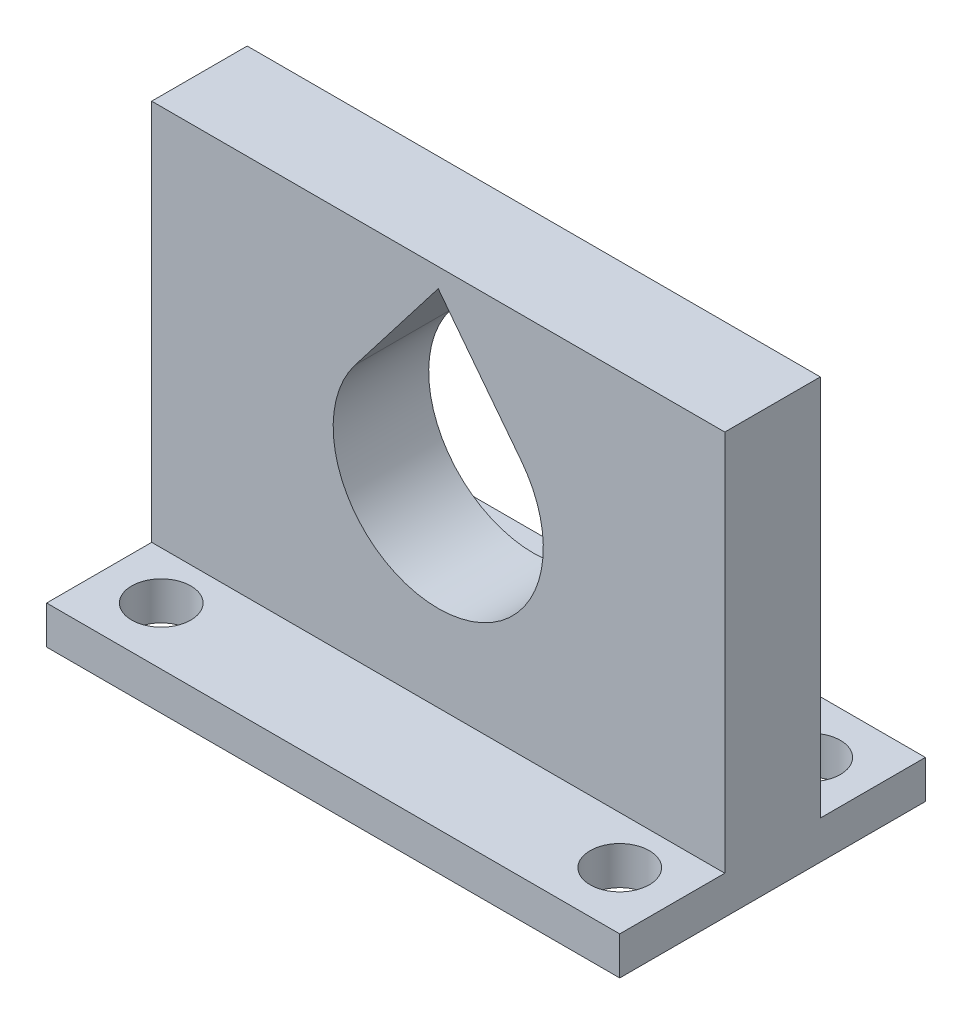
ISO-10303-21;
HEADER;
FILE_DESCRIPTION(('STEP AP214'),'2;1');
FILE_NAME('part.step','',(''),(''),'','','');
FILE_SCHEMA(('AUTOMOTIVE_DESIGN { 1 0 10303 214 1 1 1 1 }'));
ENDSEC;
DATA;
#1=APPLICATION_CONTEXT('core data for automotive mechanical design processes');
#2=APPLICATION_PROTOCOL_DEFINITION('international standard','automotive_design',2000,#1);
#3=PRODUCT_CONTEXT('',#1,'mechanical');
#4=PRODUCT('Part','Part','',(#3));
#5=PRODUCT_RELATED_PRODUCT_CATEGORY('part','',(#4));
#6=PRODUCT_DEFINITION_FORMATION('','',#4);
#7=PRODUCT_DEFINITION_CONTEXT('part definition',#1,'design');
#8=PRODUCT_DEFINITION('design','',#6,#7);
#9=PRODUCT_DEFINITION_SHAPE('','',#8);
#10=(LENGTH_UNIT() NAMED_UNIT(*) SI_UNIT(.MILLI.,.METRE.));
#11=(NAMED_UNIT(*) PLANE_ANGLE_UNIT() SI_UNIT($,.RADIAN.));
#12=(NAMED_UNIT(*) SI_UNIT($,.STERADIAN.) SOLID_ANGLE_UNIT());
#13=UNCERTAINTY_MEASURE_WITH_UNIT(LENGTH_MEASURE(1.E-05),#10,'distance_accuracy_value','');
#14=(GEOMETRIC_REPRESENTATION_CONTEXT(3) GLOBAL_UNCERTAINTY_ASSIGNED_CONTEXT((#13)) GLOBAL_UNIT_ASSIGNED_CONTEXT((#10,
#11,#12)) REPRESENTATION_CONTEXT('',''));
#15=CARTESIAN_POINT('',(0.,0.,0.));
#16=DIRECTION('',(0.,0.,1.));
#17=DIRECTION('',(1.,0.,0.));
#18=AXIS2_PLACEMENT_3D('',#15,#16,#17);
#19=CARTESIAN_POINT('',(0.,-10.,0.));
#20=DIRECTION('',(0.,-1.,0.));
#21=DIRECTION('',(0.,0.,-1.));
#22=AXIS2_PLACEMENT_3D('',#19,#20,#21);
#23=PLANE('',#22);
#24=CARTESIAN_POINT('',(-12.,-10.,-2.5));
#25=DIRECTION('',(0.,1.,0.));
#26=DIRECTION('',(0.,0.,1.));
#27=AXIS2_PLACEMENT_3D('',#24,#25,#26);
#28=CIRCLE('',#27,1.55);
#29=CARTESIAN_POINT('',(-12.,-10.,-0.950000000000002));
#30=VERTEX_POINT('',#29);
#31=EDGE_CURVE('E170',#30,#30,#28,.T.);
#32=ORIENTED_EDGE('',*,*,#31,.F.);
#33=EDGE_LOOP('',(#32));
#34=FACE_BOUND('',#33,.T.);
#35=DIRECTION('',(0.,0.,1.));
#36=VECTOR('',#35,1.);
#37=CARTESIAN_POINT('',(-15.,-10.,0.));
#38=LINE('',#37,#36);
#39=CARTESIAN_POINT('',(-15.,-10.,-5.5));
#40=VERTEX_POINT('',#39);
#41=CARTESIAN_POINT('',(-15.,-10.,0.));
#42=VERTEX_POINT('',#41);
#43=EDGE_CURVE('E223',#40,#42,#38,.T.);
#44=ORIENTED_EDGE('',*,*,#43,.T.);
#45=DIRECTION('',(1.,0.,0.));
#46=VECTOR('',#45,1.);
#47=CARTESIAN_POINT('',(0.,-10.,0.));
#48=LINE('',#47,#46);
#49=CARTESIAN_POINT('',(15.,-10.,0.));
#50=VERTEX_POINT('',#49);
#51=EDGE_CURVE('E247',#42,#50,#48,.T.);
#52=ORIENTED_EDGE('',*,*,#51,.T.);
#53=DIRECTION('',(0.,0.,1.));
#54=VECTOR('',#53,1.);
#55=CARTESIAN_POINT('',(15.,-10.,0.));
#56=LINE('',#55,#54);
#57=CARTESIAN_POINT('',(15.,-10.,-5.5));
#58=VERTEX_POINT('',#57);
#59=EDGE_CURVE('E214',#58,#50,#56,.T.);
#60=ORIENTED_EDGE('',*,*,#59,.F.);
#61=DIRECTION('',(1.,0.,0.));
#62=VECTOR('',#61,1.);
#63=CARTESIAN_POINT('',(0.,-10.,-5.5));
#64=LINE('',#63,#62);
#65=EDGE_CURVE('E202',#40,#58,#64,.T.);
#66=ORIENTED_EDGE('',*,*,#65,.F.);
#67=EDGE_LOOP('',(#44,#52,#60,#66));
#68=FACE_BOUND('',#67,.T.);
#69=CARTESIAN_POINT('',(12.,-10.,-2.5));
#70=DIRECTION('',(0.,1.,0.));
#71=DIRECTION('',(0.,0.,1.));
#72=AXIS2_PLACEMENT_3D('',#69,#70,#71);
#73=CIRCLE('',#72,1.55);
#74=CARTESIAN_POINT('',(12.,-10.,-0.949999999999999));
#75=VERTEX_POINT('',#74);
#76=EDGE_CURVE('E171',#75,#75,#73,.F.);
#77=ORIENTED_EDGE('',*,*,#76,.T.);
#78=EDGE_LOOP('',(#77));
#79=FACE_BOUND('',#78,.T.);
#80=ADVANCED_FACE('F47',(#34,#68,#79),#23,.F.);
#81=CARTESIAN_POINT('',(0.,-12.,0.));
#82=DIRECTION('',(0.,-1.,0.));
#83=DIRECTION('',(0.,0.,-1.));
#84=AXIS2_PLACEMENT_3D('',#81,#82,#83);
#85=PLANE('',#84);
#86=CARTESIAN_POINT('',(12.,-12.,-2.5));
#87=DIRECTION('',(0.,1.,0.));
#88=DIRECTION('',(0.,0.,1.));
#89=AXIS2_PLACEMENT_3D('',#86,#87,#88);
#90=CIRCLE('',#89,1.55);
#91=CARTESIAN_POINT('',(12.,-12.,-0.949999999999999));
#92=VERTEX_POINT('',#91);
#93=EDGE_CURVE('E166',#92,#92,#90,.F.);
#94=ORIENTED_EDGE('',*,*,#93,.F.);
#95=EDGE_LOOP('',(#94));
#96=FACE_BOUND('',#95,.T.);
#97=CARTESIAN_POINT('',(-12.,-12.,-2.5));
#98=DIRECTION('',(0.,1.,0.));
#99=DIRECTION('',(0.,0.,1.));
#100=AXIS2_PLACEMENT_3D('',#97,#98,#99);
#101=CIRCLE('',#100,1.55);
#102=CARTESIAN_POINT('',(-12.,-12.,-0.950000000000002));
#103=VERTEX_POINT('',#102);
#104=EDGE_CURVE('E190',#103,#103,#101,.T.);
#105=ORIENTED_EDGE('',*,*,#104,.T.);
#106=EDGE_LOOP('',(#105));
#107=FACE_BOUND('',#106,.T.);
#108=DIRECTION('',(0.,0.,1.));
#109=VECTOR('',#108,1.);
#110=CARTESIAN_POINT('',(15.,-12.,0.));
#111=LINE('',#110,#109);
#112=CARTESIAN_POINT('',(15.,-12.,-5.5));
#113=VERTEX_POINT('',#112);
#114=CARTESIAN_POINT('',(15.,-12.,10.5));
#115=VERTEX_POINT('',#114);
#116=EDGE_CURVE('E198',#113,#115,#111,.T.);
#117=ORIENTED_EDGE('',*,*,#116,.T.);
#118=DIRECTION('',(1.,0.,0.));
#119=VECTOR('',#118,1.);
#120=CARTESIAN_POINT('',(0.,-12.,10.5));
#121=LINE('',#120,#119);
#122=CARTESIAN_POINT('',(-15.,-12.,10.5));
#123=VERTEX_POINT('',#122);
#124=EDGE_CURVE('E201',#123,#115,#121,.T.);
#125=ORIENTED_EDGE('',*,*,#124,.F.);
#126=DIRECTION('',(0.,0.,1.));
#127=VECTOR('',#126,1.);
#128=CARTESIAN_POINT('',(-15.,-12.,0.));
#129=LINE('',#128,#127);
#130=CARTESIAN_POINT('',(-15.,-12.,-5.5));
#131=VERTEX_POINT('',#130);
#132=EDGE_CURVE('E206',#131,#123,#129,.T.);
#133=ORIENTED_EDGE('',*,*,#132,.F.);
#134=DIRECTION('',(1.,0.,0.));
#135=VECTOR('',#134,1.);
#136=CARTESIAN_POINT('',(0.,-12.,-5.5));
#137=LINE('',#136,#135);
#138=EDGE_CURVE('E210',#131,#113,#137,.T.);
#139=ORIENTED_EDGE('',*,*,#138,.T.);
#140=EDGE_LOOP('',(#117,#125,#133,#139));
#141=FACE_BOUND('',#140,.T.);
#142=CARTESIAN_POINT('',(12.,-12.,7.5));
#143=DIRECTION('',(0.,1.,0.));
#144=DIRECTION('',(0.,0.,1.));
#145=AXIS2_PLACEMENT_3D('',#142,#143,#144);
#146=CIRCLE('',#145,1.55);
#147=CARTESIAN_POINT('',(12.,-12.,9.05));
#148=VERTEX_POINT('',#147);
#149=EDGE_CURVE('E175',#148,#148,#146,.T.);
#150=ORIENTED_EDGE('',*,*,#149,.T.);
#151=EDGE_LOOP('',(#150));
#152=FACE_BOUND('',#151,.T.);
#153=CARTESIAN_POINT('',(-12.,-12.,7.5));
#154=DIRECTION('',(0.,1.,0.));
#155=DIRECTION('',(0.,0.,1.));
#156=AXIS2_PLACEMENT_3D('',#153,#154,#155);
#157=CIRCLE('',#156,1.55);
#158=CARTESIAN_POINT('',(-12.,-12.,9.05));
#159=VERTEX_POINT('',#158);
#160=EDGE_CURVE('E183',#159,#159,#157,.F.);
#161=ORIENTED_EDGE('',*,*,#160,.F.);
#162=EDGE_LOOP('',(#161));
#163=FACE_BOUND('',#162,.T.);
#164=ADVANCED_FACE('F300',(#96,#107,#141,#152,#163),#85,.T.);
#165=CARTESIAN_POINT('',(12.,-10.,7.5));
#166=DIRECTION('',(0.,1.,0.));
#167=DIRECTION('',(0.,0.,1.));
#168=AXIS2_PLACEMENT_3D('',#165,#166,#167);
#169=CIRCLE('',#168,1.55);
#170=CARTESIAN_POINT('',(12.,-10.,9.05));
#171=VERTEX_POINT('',#170);
#172=EDGE_CURVE('E179',#171,#171,#169,.T.);
#173=ORIENTED_EDGE('',*,*,#172,.F.);
#174=EDGE_LOOP('',(#173));
#175=FACE_BOUND('',#174,.T.);
#176=DIRECTION('',(1.,0.,0.));
#177=VECTOR('',#176,1.);
#178=CARTESIAN_POINT('',(0.,-10.,5.));
#179=LINE('',#178,#177);
#180=CARTESIAN_POINT('',(-15.,-10.,5.));
#181=VERTEX_POINT('',#180);
#182=CARTESIAN_POINT('',(15.,-10.,5.));
#183=VERTEX_POINT('',#182);
#184=EDGE_CURVE('E255',#181,#183,#179,.T.);
#185=ORIENTED_EDGE('',*,*,#184,.F.);
#186=CARTESIAN_POINT('',(-15.,-10.,10.5));
#187=VERTEX_POINT('',#186);
#188=EDGE_CURVE('E222',#181,#187,#38,.T.);
#189=ORIENTED_EDGE('',*,*,#188,.T.);
#190=DIRECTION('',(1.,0.,0.));
#191=VECTOR('',#190,1.);
#192=CARTESIAN_POINT('',(0.,-10.,10.5));
#193=LINE('',#192,#191);
#194=CARTESIAN_POINT('',(15.,-10.,10.5));
#195=VERTEX_POINT('',#194);
#196=EDGE_CURVE('E218',#187,#195,#193,.T.);
#197=ORIENTED_EDGE('',*,*,#196,.T.);
#198=EDGE_CURVE('E194',#183,#195,#56,.T.);
#199=ORIENTED_EDGE('',*,*,#198,.F.);
#200=EDGE_LOOP('',(#185,#189,#197,#199));
#201=FACE_BOUND('',#200,.T.);
#202=CARTESIAN_POINT('',(-12.,-10.,7.5));
#203=DIRECTION('',(0.,1.,0.));
#204=DIRECTION('',(0.,0.,1.));
#205=AXIS2_PLACEMENT_3D('',#202,#203,#204);
#206=CIRCLE('',#205,1.55);
#207=CARTESIAN_POINT('',(-12.,-10.,9.05));
#208=VERTEX_POINT('',#207);
#209=EDGE_CURVE('E165',#208,#208,#206,.F.);
#210=ORIENTED_EDGE('',*,*,#209,.T.);
#211=EDGE_LOOP('',(#210));
#212=FACE_BOUND('',#211,.T.);
#213=ADVANCED_FACE('F305',(#175,#201,#212),#23,.F.);
#214=CARTESIAN_POINT('',(15.,0.,5.));
#215=DIRECTION('',(-1.,0.,0.));
#216=DIRECTION('',(0.,0.,1.));
#217=AXIS2_PLACEMENT_3D('',#214,#215,#216);
#218=PLANE('',#217);
#219=DIRECTION('',(0.,1.,0.));
#220=VECTOR('',#219,1.);
#221=CARTESIAN_POINT('',(15.,0.,0.));
#222=LINE('',#221,#220);
#223=CARTESIAN_POINT('',(15.,10.,0.));
#224=VERTEX_POINT('',#223);
#225=EDGE_CURVE('E242',#50,#224,#222,.T.);
#226=ORIENTED_EDGE('',*,*,#225,.T.);
#227=DIRECTION('',(0.,0.,-1.));
#228=VECTOR('',#227,1.);
#229=CARTESIAN_POINT('',(15.,10.,5.));
#230=LINE('',#229,#228);
#231=CARTESIAN_POINT('',(15.,10.,5.));
#232=VERTEX_POINT('',#231);
#233=EDGE_CURVE('E11',#232,#224,#230,.T.);
#234=ORIENTED_EDGE('',*,*,#233,.F.);
#235=DIRECTION('',(0.,1.,0.));
#236=VECTOR('',#235,1.);
#237=CARTESIAN_POINT('',(15.,0.,5.));
#238=LINE('',#237,#236);
#239=EDGE_CURVE('E243',#183,#232,#238,.T.);
#240=ORIENTED_EDGE('',*,*,#239,.F.);
#241=ORIENTED_EDGE('',*,*,#198,.T.);
#242=DIRECTION('',(0.,1.,0.));
#243=VECTOR('',#242,1.);
#244=CARTESIAN_POINT('',(15.,-12.,10.5));
#245=LINE('',#244,#243);
#246=EDGE_CURVE('E238',#115,#195,#245,.T.);
#247=ORIENTED_EDGE('',*,*,#246,.F.);
#248=ORIENTED_EDGE('',*,*,#116,.F.);
#249=DIRECTION('',(0.,1.,0.));
#250=VECTOR('',#249,1.);
#251=CARTESIAN_POINT('',(15.,-12.,-5.5));
#252=LINE('',#251,#250);
#253=EDGE_CURVE('E213',#113,#58,#252,.T.);
#254=ORIENTED_EDGE('',*,*,#253,.T.);
#255=ORIENTED_EDGE('',*,*,#59,.T.);
#256=EDGE_LOOP('',(#226,#234,#240,#241,#247,#248,#254,#255));
#257=FACE_BOUND('',#256,.T.);
#258=ADVANCED_FACE('F49',(#257),#218,.F.);
#259=CARTESIAN_POINT('',(0.,10.,5.));
#260=DIRECTION('',(0.,1.,0.));
#261=DIRECTION('',(0.,0.,1.));
#262=AXIS2_PLACEMENT_3D('',#259,#260,#261);
#263=PLANE('',#262);
#264=DIRECTION('',(1.,0.,0.));
#265=VECTOR('',#264,1.);
#266=CARTESIAN_POINT('',(0.,10.,0.));
#267=LINE('',#266,#265);
#268=CARTESIAN_POINT('',(-15.,10.,0.));
#269=VERTEX_POINT('',#268);
#270=EDGE_CURVE('E262',#269,#224,#267,.T.);
#271=ORIENTED_EDGE('',*,*,#270,.F.);
#272=DIRECTION('',(0.,0.,-1.));
#273=VECTOR('',#272,1.);
#274=CARTESIAN_POINT('',(-15.,10.,5.));
#275=LINE('',#274,#273);
#276=CARTESIAN_POINT('',(-15.,10.,5.));
#277=VERTEX_POINT('',#276);
#278=EDGE_CURVE('E56',#277,#269,#275,.T.);
#279=ORIENTED_EDGE('',*,*,#278,.F.);
#280=DIRECTION('',(1.,0.,0.));
#281=VECTOR('',#280,1.);
#282=CARTESIAN_POINT('',(0.,10.,5.));
#283=LINE('',#282,#281);
#284=EDGE_CURVE('E246',#277,#232,#283,.T.);
#285=ORIENTED_EDGE('',*,*,#284,.T.);
#286=ORIENTED_EDGE('',*,*,#233,.T.);
#287=EDGE_LOOP('',(#271,#279,#285,#286));
#288=FACE_BOUND('',#287,.T.);
#289=ADVANCED_FACE('F281',(#288),#263,.T.);
#290=CARTESIAN_POINT('',(-15.,0.,5.));
#291=DIRECTION('',(-1.,0.,0.));
#292=DIRECTION('',(0.,0.,1.));
#293=AXIS2_PLACEMENT_3D('',#290,#291,#292);
#294=PLANE('',#293);
#295=DIRECTION('',(0.,1.,0.));
#296=VECTOR('',#295,1.);
#297=CARTESIAN_POINT('',(-15.,0.,0.));
#298=LINE('',#297,#296);
#299=EDGE_CURVE('E266',#42,#269,#298,.T.);
#300=ORIENTED_EDGE('',*,*,#299,.F.);
#301=ORIENTED_EDGE('',*,*,#43,.F.);
#302=DIRECTION('',(0.,1.,0.));
#303=VECTOR('',#302,1.);
#304=CARTESIAN_POINT('',(-15.,-12.,-5.5));
#305=LINE('',#304,#303);
#306=EDGE_CURVE('E231',#131,#40,#305,.T.);
#307=ORIENTED_EDGE('',*,*,#306,.F.);
#308=ORIENTED_EDGE('',*,*,#132,.T.);
#309=DIRECTION('',(0.,1.,0.));
#310=VECTOR('',#309,1.);
#311=CARTESIAN_POINT('',(-15.,-12.,10.5));
#312=LINE('',#311,#310);
#313=EDGE_CURVE('E234',#123,#187,#312,.T.);
#314=ORIENTED_EDGE('',*,*,#313,.T.);
#315=ORIENTED_EDGE('',*,*,#188,.F.);
#316=DIRECTION('',(0.,1.,0.));
#317=VECTOR('',#316,1.);
#318=CARTESIAN_POINT('',(-15.,0.,5.));
#319=LINE('',#318,#317);
#320=EDGE_CURVE('E251',#181,#277,#319,.T.);
#321=ORIENTED_EDGE('',*,*,#320,.T.);
#322=ORIENTED_EDGE('',*,*,#278,.T.);
#323=EDGE_LOOP('',(#300,#301,#307,#308,#314,#315,#321,#322));
#324=FACE_BOUND('',#323,.T.);
#325=ADVANCED_FACE('F275',(#324),#294,.T.);
#326=CARTESIAN_POINT('',(0.,0.,5.));
#327=DIRECTION('',(0.,0.,1.));
#328=DIRECTION('',(1.,0.,0.));
#329=AXIS2_PLACEMENT_3D('',#326,#327,#328);
#330=PLANE('',#329);
#331=DIRECTION('',(-0.611091633143925,0.791559862487664,0.));
#332=VECTOR('',#331,1.);
#333=CARTESIAN_POINT('',(4.35344048188891,3.36089685688659,5.));
#334=LINE('',#333,#332);
#335=CARTESIAN_POINT('',(4.32660605717415,3.39565605237397,5.));
#336=VERTEX_POINT('',#335);
#337=CARTESIAN_POINT('',(0.,9.,5.));
#338=VERTEX_POINT('',#337);
#339=EDGE_CURVE('E162',#336,#338,#334,.T.);
#340=ORIENTED_EDGE('',*,*,#339,.F.);
#341=CARTESIAN_POINT('',(0.,0.,5.));
#342=DIRECTION('',(0.,0.,1.));
#343=DIRECTION('',(1.,0.,0.));
#344=AXIS2_PLACEMENT_3D('',#341,#342,#343);
#345=CIRCLE('',#344,5.5);
#346=CARTESIAN_POINT('',(-4.3534965371257,3.36111111111111,5.));
#347=VERTEX_POINT('',#346);
#348=EDGE_CURVE('E156',#347,#336,#345,.T.);
#349=ORIENTED_EDGE('',*,*,#348,.F.);
#350=DIRECTION('',(0.611111111111111,0.791544824931945,0.));
#351=VECTOR('',#350,1.);
#352=CARTESIAN_POINT('',(-4.3534965371257,3.36111111111111,5.));
#353=LINE('',#352,#351);
#354=EDGE_CURVE('E135',#347,#338,#353,.T.);
#355=ORIENTED_EDGE('',*,*,#354,.T.);
#356=EDGE_LOOP('',(#340,#349,#355));
#357=FACE_BOUND('',#356,.T.);
#358=ORIENTED_EDGE('',*,*,#239,.T.);
#359=ORIENTED_EDGE('',*,*,#284,.F.);
#360=ORIENTED_EDGE('',*,*,#320,.F.);
#361=ORIENTED_EDGE('',*,*,#184,.T.);
#362=EDGE_LOOP('',(#358,#359,#360,#361));
#363=FACE_BOUND('',#362,.T.);
#364=ADVANCED_FACE('F311',(#357,#363),#330,.T.);
#365=CARTESIAN_POINT('',(0.,0.,0.));
#366=DIRECTION('',(0.,0.,1.));
#367=DIRECTION('',(1.,0.,0.));
#368=AXIS2_PLACEMENT_3D('',#365,#366,#367);
#369=PLANE('',#368);
#370=CARTESIAN_POINT('',(0.,0.,0.));
#371=DIRECTION('',(0.,0.,-1.));
#372=DIRECTION('',(-1.,0.,0.));
#373=AXIS2_PLACEMENT_3D('',#370,#371,#372);
#374=CIRCLE('',#373,5.5);
#375=CARTESIAN_POINT('',(4.32660605717415,3.39565605237397,0.));
#376=VERTEX_POINT('',#375);
#377=CARTESIAN_POINT('',(-4.3534965371257,3.36111111111111,0.));
#378=VERTEX_POINT('',#377);
#379=EDGE_CURVE('E142',#376,#378,#374,.T.);
#380=ORIENTED_EDGE('',*,*,#379,.F.);
#381=DIRECTION('',(0.611091633143925,-0.791559862487664,0.));
#382=VECTOR('',#381,1.);
#383=CARTESIAN_POINT('',(4.35344048188891,3.36089685688659,0.));
#384=LINE('',#383,#382);
#385=CARTESIAN_POINT('',(0.,9.,0.));
#386=VERTEX_POINT('',#385);
#387=EDGE_CURVE('E71',#386,#376,#384,.T.);
#388=ORIENTED_EDGE('',*,*,#387,.F.);
#389=DIRECTION('',(-0.611111111111111,-0.791544824931945,0.));
#390=VECTOR('',#389,1.);
#391=CARTESIAN_POINT('',(-4.3534965371257,3.36111111111111,0.));
#392=LINE('',#391,#390);
#393=EDGE_CURVE('E133',#386,#378,#392,.T.);
#394=ORIENTED_EDGE('',*,*,#393,.T.);
#395=EDGE_LOOP('',(#380,#388,#394));
#396=FACE_BOUND('',#395,.T.);
#397=ORIENTED_EDGE('',*,*,#225,.F.);
#398=ORIENTED_EDGE('',*,*,#51,.F.);
#399=ORIENTED_EDGE('',*,*,#299,.T.);
#400=ORIENTED_EDGE('',*,*,#270,.T.);
#401=EDGE_LOOP('',(#397,#398,#399,#400));
#402=FACE_BOUND('',#401,.T.);
#403=ADVANCED_FACE('F147',(#396,#402),#369,.F.);
#404=CARTESIAN_POINT('',(0.,-12.,10.5));
#405=DIRECTION('',(0.,0.,1.));
#406=DIRECTION('',(1.,0.,0.));
#407=AXIS2_PLACEMENT_3D('',#404,#405,#406);
#408=PLANE('',#407);
#409=ORIENTED_EDGE('',*,*,#196,.F.);
#410=ORIENTED_EDGE('',*,*,#313,.F.);
#411=ORIENTED_EDGE('',*,*,#124,.T.);
#412=ORIENTED_EDGE('',*,*,#246,.T.);
#413=EDGE_LOOP('',(#409,#410,#411,#412));
#414=FACE_BOUND('',#413,.T.);
#415=ADVANCED_FACE('F303',(#414),#408,.T.);
#416=CARTESIAN_POINT('',(0.,-12.,-5.5));
#417=DIRECTION('',(0.,0.,1.));
#418=DIRECTION('',(1.,0.,0.));
#419=AXIS2_PLACEMENT_3D('',#416,#417,#418);
#420=PLANE('',#419);
#421=ORIENTED_EDGE('',*,*,#65,.T.);
#422=ORIENTED_EDGE('',*,*,#253,.F.);
#423=ORIENTED_EDGE('',*,*,#138,.F.);
#424=ORIENTED_EDGE('',*,*,#306,.T.);
#425=EDGE_LOOP('',(#421,#422,#423,#424));
#426=FACE_BOUND('',#425,.T.);
#427=ADVANCED_FACE('F295',(#426),#420,.F.);
#428=CARTESIAN_POINT('',(12.,-12.,7.5));
#429=DIRECTION('',(0.,1.,0.));
#430=DIRECTION('',(0.,0.,1.));
#431=AXIS2_PLACEMENT_3D('',#428,#429,#430);
#432=CYLINDRICAL_SURFACE('',#431,1.55);
#433=ORIENTED_EDGE('',*,*,#149,.F.);
#434=EDGE_LOOP('',(#433));
#435=FACE_BOUND('',#434,.T.);
#436=ORIENTED_EDGE('',*,*,#172,.T.);
#437=EDGE_LOOP('',(#436));
#438=FACE_BOUND('',#437,.T.);
#439=ADVANCED_FACE('F343',(#435,#438),#432,.F.);
#440=CARTESIAN_POINT('',(-12.,-12.,7.5));
#441=DIRECTION('',(0.,1.,0.));
#442=DIRECTION('',(0.,0.,1.));
#443=AXIS2_PLACEMENT_3D('',#440,#441,#442);
#444=CYLINDRICAL_SURFACE('',#443,1.55);
#445=ORIENTED_EDGE('',*,*,#160,.T.);
#446=EDGE_LOOP('',(#445));
#447=FACE_BOUND('',#446,.T.);
#448=ORIENTED_EDGE('',*,*,#209,.F.);
#449=EDGE_LOOP('',(#448));
#450=FACE_BOUND('',#449,.T.);
#451=ADVANCED_FACE('F344',(#447,#450),#444,.F.);
#452=CARTESIAN_POINT('',(-12.,-12.,-2.5));
#453=DIRECTION('',(0.,1.,0.));
#454=DIRECTION('',(0.,0.,1.));
#455=AXIS2_PLACEMENT_3D('',#452,#453,#454);
#456=CYLINDRICAL_SURFACE('',#455,1.55);
#457=ORIENTED_EDGE('',*,*,#104,.F.);
#458=EDGE_LOOP('',(#457));
#459=FACE_BOUND('',#458,.T.);
#460=ORIENTED_EDGE('',*,*,#31,.T.);
#461=EDGE_LOOP('',(#460));
#462=FACE_BOUND('',#461,.T.);
#463=ADVANCED_FACE('F350',(#459,#462),#456,.F.);
#464=CARTESIAN_POINT('',(12.,-12.,-2.5));
#465=DIRECTION('',(0.,1.,0.));
#466=DIRECTION('',(0.,0.,1.));
#467=AXIS2_PLACEMENT_3D('',#464,#465,#466);
#468=CYLINDRICAL_SURFACE('',#467,1.55);
#469=ORIENTED_EDGE('',*,*,#93,.T.);
#470=EDGE_LOOP('',(#469));
#471=FACE_BOUND('',#470,.T.);
#472=ORIENTED_EDGE('',*,*,#76,.F.);
#473=EDGE_LOOP('',(#472));
#474=FACE_BOUND('',#473,.T.);
#475=ADVANCED_FACE('F355',(#471,#474),#468,.F.);
#476=CARTESIAN_POINT('',(4.35344048188891,3.36089685688659,10.));
#477=DIRECTION('',(0.791559862487664,0.611091633143925,0.));
#478=DIRECTION('',(-0.611091633143925,0.791559862487664,0.));
#479=AXIS2_PLACEMENT_3D('',#476,#477,#478);
#480=PLANE('',#479);
#481=ORIENTED_EDGE('',*,*,#339,.T.);
#482=DIRECTION('',(0.,0.,-1.));
#483=VECTOR('',#482,1.);
#484=CARTESIAN_POINT('',(0.,9.,10.));
#485=LINE('',#484,#483);
#486=EDGE_CURVE('E138',#338,#386,#485,.T.);
#487=ORIENTED_EDGE('',*,*,#486,.T.);
#488=ORIENTED_EDGE('',*,*,#387,.T.);
#489=DIRECTION('',(0.,0.,-1.));
#490=VECTOR('',#489,1.);
#491=CARTESIAN_POINT('',(4.32660605717415,3.39565605237397,10.));
#492=LINE('',#491,#490);
#493=EDGE_CURVE('E139',#336,#376,#492,.T.);
#494=ORIENTED_EDGE('',*,*,#493,.F.);
#495=EDGE_LOOP('',(#481,#487,#488,#494));
#496=FACE_BOUND('',#495,.T.);
#497=ADVANCED_FACE('F362',(#496),#480,.F.);
#498=CARTESIAN_POINT('',(-4.3534965371257,3.36111111111111,10.));
#499=DIRECTION('',(0.791544824931945,-0.611111111111111,0.));
#500=DIRECTION('',(0.611111111111111,0.791544824931945,0.));
#501=AXIS2_PLACEMENT_3D('',#498,#499,#500);
#502=PLANE('',#501);
#503=DIRECTION('',(0.,0.,-1.));
#504=VECTOR('',#503,1.);
#505=CARTESIAN_POINT('',(-4.3534965371257,3.36111111111111,10.));
#506=LINE('',#505,#504);
#507=EDGE_CURVE('E63',#347,#378,#506,.T.);
#508=ORIENTED_EDGE('',*,*,#507,.T.);
#509=ORIENTED_EDGE('',*,*,#393,.F.);
#510=ORIENTED_EDGE('',*,*,#486,.F.);
#511=ORIENTED_EDGE('',*,*,#354,.F.);
#512=EDGE_LOOP('',(#508,#509,#510,#511));
#513=FACE_BOUND('',#512,.T.);
#514=ADVANCED_FACE('F130',(#513),#502,.T.);
#515=CARTESIAN_POINT('',(0.,0.,10.));
#516=DIRECTION('',(0.,0.,-1.));
#517=DIRECTION('',(-1.,0.,0.));
#518=AXIS2_PLACEMENT_3D('',#515,#516,#517);
#519=CYLINDRICAL_SURFACE('',#518,5.5);
#520=ORIENTED_EDGE('',*,*,#348,.T.);
#521=ORIENTED_EDGE('',*,*,#493,.T.);
#522=ORIENTED_EDGE('',*,*,#379,.T.);
#523=ORIENTED_EDGE('',*,*,#507,.F.);
#524=EDGE_LOOP('',(#520,#521,#522,#523));
#525=FACE_BOUND('',#524,.T.);
#526=ADVANCED_FACE('F143',(#525),#519,.F.);
#527=CLOSED_SHELL('',(#80,#164,#213,#258,#289,#325,#364,#403,#415,#427,#439,#451,#463,#475,#497,
#514,#526));
#528=MANIFOLD_SOLID_BREP('B2',#527);
#529=ADVANCED_BREP_SHAPE_REPRESENTATION('',(#18,#528),#14);
#530=SHAPE_DEFINITION_REPRESENTATION(#9,#529);
ENDSEC;
END-ISO-10303-21;
